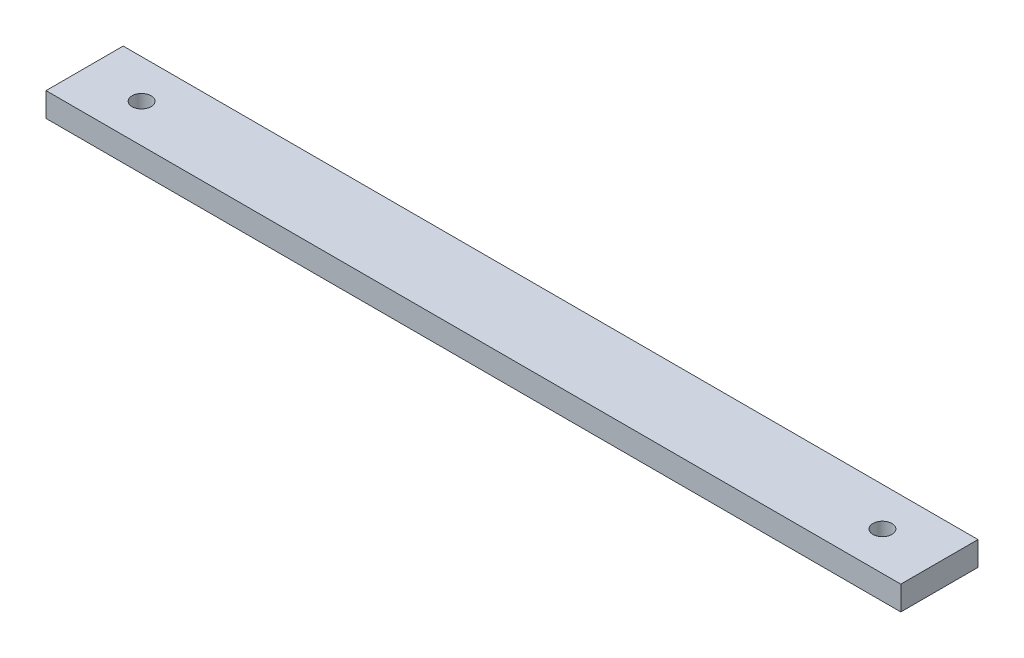
ISO-10303-21;
HEADER;
FILE_DESCRIPTION(('STEP AP214'),'2;1');
FILE_NAME('part.step','',(''),(''),'','','');
FILE_SCHEMA(('AUTOMOTIVE_DESIGN { 1 0 10303 214 1 1 1 1 }'));
ENDSEC;
DATA;
#1=APPLICATION_CONTEXT('core data for automotive mechanical design processes');
#2=APPLICATION_PROTOCOL_DEFINITION('international standard','automotive_design',2000,#1);
#3=PRODUCT_CONTEXT('',#1,'mechanical');
#4=PRODUCT('Part','Part','',(#3));
#5=PRODUCT_RELATED_PRODUCT_CATEGORY('part','',(#4));
#6=PRODUCT_DEFINITION_FORMATION('','',#4);
#7=PRODUCT_DEFINITION_CONTEXT('part definition',#1,'design');
#8=PRODUCT_DEFINITION('design','',#6,#7);
#9=PRODUCT_DEFINITION_SHAPE('','',#8);
#10=(LENGTH_UNIT() NAMED_UNIT(*) SI_UNIT(.MILLI.,.METRE.));
#11=(NAMED_UNIT(*) PLANE_ANGLE_UNIT() SI_UNIT($,.RADIAN.));
#12=(NAMED_UNIT(*) SI_UNIT($,.STERADIAN.) SOLID_ANGLE_UNIT());
#13=UNCERTAINTY_MEASURE_WITH_UNIT(LENGTH_MEASURE(1.E-05),#10,'distance_accuracy_value','');
#14=(GEOMETRIC_REPRESENTATION_CONTEXT(3) GLOBAL_UNCERTAINTY_ASSIGNED_CONTEXT((#13)) GLOBAL_UNIT_ASSIGNED_CONTEXT((#10,
#11,#12)) REPRESENTATION_CONTEXT('',''));
#15=CARTESIAN_POINT('',(0.,0.,0.));
#16=DIRECTION('',(0.,0.,1.));
#17=DIRECTION('',(1.,0.,0.));
#18=AXIS2_PLACEMENT_3D('',#15,#16,#17);
#19=CARTESIAN_POINT('',(0.,6.35,0.));
#20=DIRECTION('',(0.,-1.,0.));
#21=DIRECTION('',(0.,0.,-1.));
#22=AXIS2_PLACEMENT_3D('',#19,#20,#21);
#23=PLANE('',#22);
#24=DIRECTION('',(0.,0.,1.));
#25=VECTOR('',#24,1.);
#26=CARTESIAN_POINT('',(0.,6.35,0.));
#27=LINE('',#26,#25);
#28=CARTESIAN_POINT('',(0.,6.35,-20.32));
#29=VERTEX_POINT('',#28);
#30=CARTESIAN_POINT('',(0.,6.35,0.));
#31=VERTEX_POINT('',#30);
#32=EDGE_CURVE('E92',#29,#31,#27,.T.);
#33=ORIENTED_EDGE('',*,*,#32,.T.);
#34=DIRECTION('',(1.,0.,0.));
#35=VECTOR('',#34,1.);
#36=CARTESIAN_POINT('',(0.,6.35,0.));
#37=LINE('',#36,#35);
#38=CARTESIAN_POINT('',(225.,6.35,0.));
#39=VERTEX_POINT('',#38);
#40=EDGE_CURVE('E87',#31,#39,#37,.T.);
#41=ORIENTED_EDGE('',*,*,#40,.T.);
#42=DIRECTION('',(0.,0.,-1.));
#43=VECTOR('',#42,1.);
#44=CARTESIAN_POINT('',(225.,6.35,0.));
#45=LINE('',#44,#43);
#46=CARTESIAN_POINT('',(225.,6.35,-20.32));
#47=VERTEX_POINT('',#46);
#48=EDGE_CURVE('E90',#39,#47,#45,.T.);
#49=ORIENTED_EDGE('',*,*,#48,.T.);
#50=DIRECTION('',(-1.,0.,0.));
#51=VECTOR('',#50,1.);
#52=CARTESIAN_POINT('',(0.,6.35,-20.32));
#53=LINE('',#52,#51);
#54=EDGE_CURVE('E57',#47,#29,#53,.T.);
#55=ORIENTED_EDGE('',*,*,#54,.T.);
#56=EDGE_LOOP('',(#33,#41,#49,#55));
#57=FACE_BOUND('',#56,.T.);
#58=CARTESIAN_POINT('',(15.,6.35,-10.16));
#59=DIRECTION('',(0.,1.,0.));
#60=DIRECTION('',(0.,0.,1.));
#61=AXIS2_PLACEMENT_3D('',#58,#59,#60);
#62=CIRCLE('',#61,2.5);
#63=CARTESIAN_POINT('',(15.,6.35,-7.66));
#64=VERTEX_POINT('',#63);
#65=EDGE_CURVE('E112',#64,#64,#62,.T.);
#66=ORIENTED_EDGE('',*,*,#65,.F.);
#67=EDGE_LOOP('',(#66));
#68=FACE_BOUND('',#67,.T.);
#69=CARTESIAN_POINT('',(210.,6.35,-10.16));
#70=DIRECTION('',(0.,1.,0.));
#71=DIRECTION('',(0.,0.,-1.));
#72=AXIS2_PLACEMENT_3D('',#69,#70,#71);
#73=CIRCLE('',#72,2.5);
#74=CARTESIAN_POINT('',(210.,6.35,-12.66));
#75=VERTEX_POINT('',#74);
#76=EDGE_CURVE('E134',#75,#75,#73,.T.);
#77=ORIENTED_EDGE('',*,*,#76,.F.);
#78=EDGE_LOOP('',(#77));
#79=FACE_BOUND('',#78,.T.);
#80=ADVANCED_FACE('F39',(#57,#68,#79),#23,.F.);
#81=CARTESIAN_POINT('',(0.,0.,0.));
#82=DIRECTION('',(0.,-1.,0.));
#83=DIRECTION('',(0.,0.,-1.));
#84=AXIS2_PLACEMENT_3D('',#81,#82,#83);
#85=PLANE('',#84);
#86=CARTESIAN_POINT('',(15.,0.,-10.16));
#87=DIRECTION('',(0.,1.,0.));
#88=DIRECTION('',(0.,0.,1.));
#89=AXIS2_PLACEMENT_3D('',#86,#87,#88);
#90=CIRCLE('',#89,2.5);
#91=CARTESIAN_POINT('',(15.,0.,-7.66));
#92=VERTEX_POINT('',#91);
#93=EDGE_CURVE('E130',#92,#92,#90,.T.);
#94=ORIENTED_EDGE('',*,*,#93,.T.);
#95=EDGE_LOOP('',(#94));
#96=FACE_BOUND('',#95,.T.);
#97=DIRECTION('',(0.,0.,1.));
#98=VECTOR('',#97,1.);
#99=CARTESIAN_POINT('',(0.,0.,0.));
#100=LINE('',#99,#98);
#101=CARTESIAN_POINT('',(0.,0.,-20.32));
#102=VERTEX_POINT('',#101);
#103=CARTESIAN_POINT('',(0.,0.,0.));
#104=VERTEX_POINT('',#103);
#105=EDGE_CURVE('E108',#102,#104,#100,.T.);
#106=ORIENTED_EDGE('',*,*,#105,.F.);
#107=DIRECTION('',(-1.,0.,0.));
#108=VECTOR('',#107,1.);
#109=CARTESIAN_POINT('',(0.,0.,-20.32));
#110=LINE('',#109,#108);
#111=CARTESIAN_POINT('',(225.,0.,-20.32));
#112=VERTEX_POINT('',#111);
#113=EDGE_CURVE('E80',#112,#102,#110,.T.);
#114=ORIENTED_EDGE('',*,*,#113,.F.);
#115=DIRECTION('',(0.,0.,-1.));
#116=VECTOR('',#115,1.);
#117=CARTESIAN_POINT('',(225.,0.,0.));
#118=LINE('',#117,#116);
#119=CARTESIAN_POINT('',(225.,0.,0.));
#120=VERTEX_POINT('',#119);
#121=EDGE_CURVE('E74',#120,#112,#118,.T.);
#122=ORIENTED_EDGE('',*,*,#121,.F.);
#123=DIRECTION('',(1.,0.,0.));
#124=VECTOR('',#123,1.);
#125=CARTESIAN_POINT('',(0.,0.,0.));
#126=LINE('',#125,#124);
#127=EDGE_CURVE('E97',#104,#120,#126,.T.);
#128=ORIENTED_EDGE('',*,*,#127,.F.);
#129=EDGE_LOOP('',(#106,#114,#122,#128));
#130=FACE_BOUND('',#129,.T.);
#131=CARTESIAN_POINT('',(210.,0.,-10.16));
#132=DIRECTION('',(0.,1.,0.));
#133=DIRECTION('',(0.,0.,-1.));
#134=AXIS2_PLACEMENT_3D('',#131,#132,#133);
#135=CIRCLE('',#134,2.5);
#136=CARTESIAN_POINT('',(210.,0.,-12.66));
#137=VERTEX_POINT('',#136);
#138=EDGE_CURVE('E138',#137,#137,#135,.T.);
#139=ORIENTED_EDGE('',*,*,#138,.T.);
#140=EDGE_LOOP('',(#139));
#141=FACE_BOUND('',#140,.T.);
#142=ADVANCED_FACE('F125',(#96,#130,#141),#85,.T.);
#143=CARTESIAN_POINT('',(0.,6.35,0.));
#144=DIRECTION('',(1.,0.,0.));
#145=DIRECTION('',(0.,0.,-1.));
#146=AXIS2_PLACEMENT_3D('',#143,#144,#145);
#147=PLANE('',#146);
#148=ORIENTED_EDGE('',*,*,#105,.T.);
#149=DIRECTION('',(0.,-1.,0.));
#150=VECTOR('',#149,1.);
#151=CARTESIAN_POINT('',(0.,6.35,0.));
#152=LINE('',#151,#150);
#153=EDGE_CURVE('E11',#31,#104,#152,.T.);
#154=ORIENTED_EDGE('',*,*,#153,.F.);
#155=ORIENTED_EDGE('',*,*,#32,.F.);
#156=DIRECTION('',(0.,-1.,0.));
#157=VECTOR('',#156,1.);
#158=CARTESIAN_POINT('',(0.,6.35,-20.32));
#159=LINE('',#158,#157);
#160=EDGE_CURVE('E104',#29,#102,#159,.T.);
#161=ORIENTED_EDGE('',*,*,#160,.T.);
#162=EDGE_LOOP('',(#148,#154,#155,#161));
#163=FACE_BOUND('',#162,.T.);
#164=ADVANCED_FACE('F41',(#163),#147,.F.);
#165=CARTESIAN_POINT('',(0.,6.35,0.));
#166=DIRECTION('',(0.,0.,-1.));
#167=DIRECTION('',(-1.,0.,0.));
#168=AXIS2_PLACEMENT_3D('',#165,#166,#167);
#169=PLANE('',#168);
#170=ORIENTED_EDGE('',*,*,#127,.T.);
#171=DIRECTION('',(0.,-1.,0.));
#172=VECTOR('',#171,1.);
#173=CARTESIAN_POINT('',(225.,6.35,0.));
#174=LINE('',#173,#172);
#175=EDGE_CURVE('E49',#39,#120,#174,.T.);
#176=ORIENTED_EDGE('',*,*,#175,.F.);
#177=ORIENTED_EDGE('',*,*,#40,.F.);
#178=ORIENTED_EDGE('',*,*,#153,.T.);
#179=EDGE_LOOP('',(#170,#176,#177,#178));
#180=FACE_BOUND('',#179,.T.);
#181=ADVANCED_FACE('F96',(#180),#169,.F.);
#182=CARTESIAN_POINT('',(225.,6.35,0.));
#183=DIRECTION('',(-1.,0.,0.));
#184=DIRECTION('',(0.,0.,1.));
#185=AXIS2_PLACEMENT_3D('',#182,#183,#184);
#186=PLANE('',#185);
#187=ORIENTED_EDGE('',*,*,#121,.T.);
#188=DIRECTION('',(0.,-1.,0.));
#189=VECTOR('',#188,1.);
#190=CARTESIAN_POINT('',(225.,6.35,-20.32));
#191=LINE('',#190,#189);
#192=EDGE_CURVE('E99',#47,#112,#191,.T.);
#193=ORIENTED_EDGE('',*,*,#192,.F.);
#194=ORIENTED_EDGE('',*,*,#48,.F.);
#195=ORIENTED_EDGE('',*,*,#175,.T.);
#196=EDGE_LOOP('',(#187,#193,#194,#195));
#197=FACE_BOUND('',#196,.T.);
#198=ADVANCED_FACE('F100',(#197),#186,.F.);
#199=CARTESIAN_POINT('',(0.,6.35,-20.32));
#200=DIRECTION('',(0.,0.,1.));
#201=DIRECTION('',(1.,0.,0.));
#202=AXIS2_PLACEMENT_3D('',#199,#200,#201);
#203=PLANE('',#202);
#204=ORIENTED_EDGE('',*,*,#113,.T.);
#205=ORIENTED_EDGE('',*,*,#160,.F.);
#206=ORIENTED_EDGE('',*,*,#54,.F.);
#207=ORIENTED_EDGE('',*,*,#192,.T.);
#208=EDGE_LOOP('',(#204,#205,#206,#207));
#209=FACE_BOUND('',#208,.T.);
#210=ADVANCED_FACE('F122',(#209),#203,.F.);
#211=CARTESIAN_POINT('',(15.,6.35,-10.16));
#212=DIRECTION('',(0.,-1.,0.));
#213=DIRECTION('',(0.,0.,-1.));
#214=AXIS2_PLACEMENT_3D('',#211,#212,#213);
#215=CYLINDRICAL_SURFACE('',#214,2.5);
#216=ORIENTED_EDGE('',*,*,#65,.T.);
#217=EDGE_LOOP('',(#216));
#218=FACE_BOUND('',#217,.T.);
#219=ORIENTED_EDGE('',*,*,#93,.F.);
#220=EDGE_LOOP('',(#219));
#221=FACE_BOUND('',#220,.T.);
#222=ADVANCED_FACE('F157',(#218,#221),#215,.F.);
#223=CARTESIAN_POINT('',(210.,6.35,-10.16));
#224=DIRECTION('',(0.,-1.,0.));
#225=DIRECTION('',(0.,0.,-1.));
#226=AXIS2_PLACEMENT_3D('',#223,#224,#225);
#227=CYLINDRICAL_SURFACE('',#226,2.5);
#228=ORIENTED_EDGE('',*,*,#76,.T.);
#229=EDGE_LOOP('',(#228));
#230=FACE_BOUND('',#229,.T.);
#231=ORIENTED_EDGE('',*,*,#138,.F.);
#232=EDGE_LOOP('',(#231));
#233=FACE_BOUND('',#232,.T.);
#234=ADVANCED_FACE('F146',(#230,#233),#227,.F.);
#235=CLOSED_SHELL('',(#80,#142,#164,#181,#198,#210,#222,#234));
#236=MANIFOLD_SOLID_BREP('B2',#235);
#237=ADVANCED_BREP_SHAPE_REPRESENTATION('',(#18,#236),#14);
#238=SHAPE_DEFINITION_REPRESENTATION(#9,#237);
ENDSEC;
END-ISO-10303-21;
